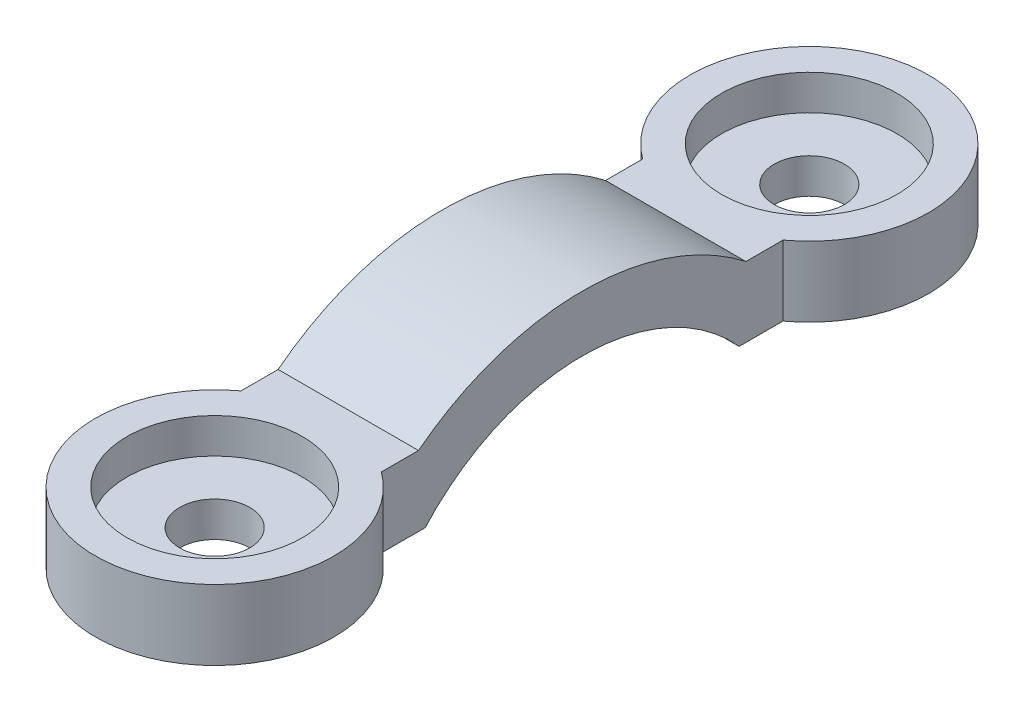
ISO-10303-21;
HEADER;
FILE_DESCRIPTION(('STEP AP214'),'2;1');
FILE_NAME('part.step','',(''),(''),'','','');
FILE_SCHEMA(('AUTOMOTIVE_DESIGN { 1 0 10303 214 1 1 1 1 }'));
ENDSEC;
DATA;
#1=APPLICATION_CONTEXT('core data for automotive mechanical design processes');
#2=APPLICATION_PROTOCOL_DEFINITION('international standard','automotive_design',2000,#1);
#3=PRODUCT_CONTEXT('',#1,'mechanical');
#4=PRODUCT('Part','Part','',(#3));
#5=PRODUCT_RELATED_PRODUCT_CATEGORY('part','',(#4));
#6=PRODUCT_DEFINITION_FORMATION('','',#4);
#7=PRODUCT_DEFINITION_CONTEXT('part definition',#1,'design');
#8=PRODUCT_DEFINITION('design','',#6,#7);
#9=PRODUCT_DEFINITION_SHAPE('','',#8);
#10=(LENGTH_UNIT() NAMED_UNIT(*) SI_UNIT(.MILLI.,.METRE.));
#11=(NAMED_UNIT(*) PLANE_ANGLE_UNIT() SI_UNIT($,.RADIAN.));
#12=(NAMED_UNIT(*) SI_UNIT($,.STERADIAN.) SOLID_ANGLE_UNIT());
#13=UNCERTAINTY_MEASURE_WITH_UNIT(LENGTH_MEASURE(1.E-05),#10,'distance_accuracy_value','');
#14=(GEOMETRIC_REPRESENTATION_CONTEXT(3) GLOBAL_UNCERTAINTY_ASSIGNED_CONTEXT((#13)) GLOBAL_UNIT_ASSIGNED_CONTEXT((#10,
#11,#12)) REPRESENTATION_CONTEXT('',''));
#15=CARTESIAN_POINT('',(0.,0.,0.));
#16=DIRECTION('',(0.,0.,1.));
#17=DIRECTION('',(1.,0.,0.));
#18=AXIS2_PLACEMENT_3D('',#15,#16,#17);
#19=CARTESIAN_POINT('',(5.,19.,21.180339887499));
#20=DIRECTION('',(0.,-1.,0.));
#21=DIRECTION('',(0.,0.,-1.));
#22=AXIS2_PLACEMENT_3D('',#19,#20,#21);
#23=CYLINDRICAL_SURFACE('',#22,2.5);
#24=CARTESIAN_POINT('',(5.,10.,21.180339887499));
#25=DIRECTION('',(0.,-1.,0.));
#26=DIRECTION('',(0.,0.,-1.));
#27=AXIS2_PLACEMENT_3D('',#24,#25,#26);
#28=CIRCLE('',#27,2.5);
#29=CARTESIAN_POINT('',(5.,10.,18.680339887499));
#30=VERTEX_POINT('',#29);
#31=EDGE_CURVE('E169',#30,#30,#28,.T.);
#32=ORIENTED_EDGE('',*,*,#31,.T.);
#33=EDGE_LOOP('',(#32));
#34=FACE_BOUND('',#33,.T.);
#35=CARTESIAN_POINT('',(5.,12.5,21.180339887499));
#36=DIRECTION('',(0.,1.,0.));
#37=DIRECTION('',(0.,0.,1.));
#38=AXIS2_PLACEMENT_3D('',#35,#36,#37);
#39=CIRCLE('',#38,2.5);
#40=CARTESIAN_POINT('',(5.,12.5,23.680339887499));
#41=VERTEX_POINT('',#40);
#42=EDGE_CURVE('E38',#41,#41,#39,.F.);
#43=ORIENTED_EDGE('',*,*,#42,.F.);
#44=EDGE_LOOP('',(#43));
#45=FACE_BOUND('',#44,.T.);
#46=ADVANCED_FACE('F34',(#34,#45),#23,.F.);
#47=CARTESIAN_POINT('',(5.,19.,-21.180339887499));
#48=DIRECTION('',(0.,-1.,0.));
#49=DIRECTION('',(0.,0.,-1.));
#50=AXIS2_PLACEMENT_3D('',#47,#48,#49);
#51=CYLINDRICAL_SURFACE('',#50,2.5);
#52=CARTESIAN_POINT('',(5.,10.,-21.180339887499));
#53=DIRECTION('',(0.,-1.,0.));
#54=DIRECTION('',(0.,0.,1.));
#55=AXIS2_PLACEMENT_3D('',#52,#53,#54);
#56=CIRCLE('',#55,2.5);
#57=CARTESIAN_POINT('',(5.,10.,-18.680339887499));
#58=VERTEX_POINT('',#57);
#59=EDGE_CURVE('E166',#58,#58,#56,.T.);
#60=ORIENTED_EDGE('',*,*,#59,.T.);
#61=EDGE_LOOP('',(#60));
#62=FACE_BOUND('',#61,.T.);
#63=CARTESIAN_POINT('',(5.,12.5,-21.180339887499));
#64=DIRECTION('',(0.,1.,0.));
#65=DIRECTION('',(0.,0.,1.));
#66=AXIS2_PLACEMENT_3D('',#63,#64,#65);
#67=CIRCLE('',#66,2.5);
#68=CARTESIAN_POINT('',(5.,12.5,-18.680339887499));
#69=VERTEX_POINT('',#68);
#70=EDGE_CURVE('E141',#69,#69,#67,.F.);
#71=ORIENTED_EDGE('',*,*,#70,.F.);
#72=EDGE_LOOP('',(#71));
#73=FACE_BOUND('',#72,.T.);
#74=ADVANCED_FACE('F219',(#62,#73),#51,.F.);
#75=CARTESIAN_POINT('',(10.,15.,0.));
#76=DIRECTION('',(0.,-1.,0.));
#77=DIRECTION('',(0.,0.,-1.));
#78=AXIS2_PLACEMENT_3D('',#75,#76,#77);
#79=PLANE('',#78);
#80=CARTESIAN_POINT('',(5.,15.,-21.180339887499));
#81=DIRECTION('',(0.,1.,0.));
#82=DIRECTION('',(0.,0.,1.));
#83=AXIS2_PLACEMENT_3D('',#80,#81,#82);
#84=CIRCLE('',#83,6.25);
#85=CARTESIAN_POINT('',(5.,15.,-14.930339887499));
#86=VERTEX_POINT('',#85);
#87=EDGE_CURVE('E148',#86,#86,#84,.T.);
#88=ORIENTED_EDGE('',*,*,#87,.F.);
#89=EDGE_LOOP('',(#88));
#90=FACE_BOUND('',#89,.T.);
#91=DIRECTION('',(0.,0.,1.));
#92=VECTOR('',#91,1.);
#93=CARTESIAN_POINT('',(10.,15.,0.));
#94=LINE('',#93,#92);
#95=CARTESIAN_POINT('',(10.,15.,-14.3064763450652));
#96=VERTEX_POINT('',#95);
#97=CARTESIAN_POINT('',(10.,15.,-11.6619037896906));
#98=VERTEX_POINT('',#97);
#99=EDGE_CURVE('E122',#96,#98,#94,.T.);
#100=ORIENTED_EDGE('',*,*,#99,.F.);
#101=CARTESIAN_POINT('',(5.,15.,-21.180339887499));
#102=DIRECTION('',(0.,1.,0.));
#103=DIRECTION('',(0.,0.,1.));
#104=AXIS2_PLACEMENT_3D('',#101,#102,#103);
#105=CIRCLE('',#104,8.5);
#106=CARTESIAN_POINT('',(0.,15.,-14.3064763450652));
#107=VERTEX_POINT('',#106);
#108=EDGE_CURVE('E108',#96,#107,#105,.T.);
#109=ORIENTED_EDGE('',*,*,#108,.T.);
#110=DIRECTION('',(0.,0.,1.));
#111=VECTOR('',#110,1.);
#112=CARTESIAN_POINT('',(0.,15.,0.));
#113=LINE('',#112,#111);
#114=CARTESIAN_POINT('',(0.,15.,-11.6619037896906));
#115=VERTEX_POINT('',#114);
#116=EDGE_CURVE('E118',#107,#115,#113,.T.);
#117=ORIENTED_EDGE('',*,*,#116,.T.);
#118=DIRECTION('',(-1.,0.,0.));
#119=VECTOR('',#118,1.);
#120=CARTESIAN_POINT('',(10.,15.,-11.6619037896906));
#121=LINE('',#120,#119);
#122=EDGE_CURVE('E138',#98,#115,#121,.T.);
#123=ORIENTED_EDGE('',*,*,#122,.F.);
#124=EDGE_LOOP('',(#100,#109,#117,#123));
#125=FACE_BOUND('',#124,.T.);
#126=ADVANCED_FACE('F36',(#90,#125),#79,.F.);
#127=CARTESIAN_POINT('',(10.,0.,0.));
#128=DIRECTION('',(-1.,0.,0.));
#129=DIRECTION('',(0.,0.,1.));
#130=AXIS2_PLACEMENT_3D('',#127,#128,#129);
#131=CYLINDRICAL_SURFACE('',#130,19.);
#132=CARTESIAN_POINT('',(0.,0.,0.));
#133=DIRECTION('',(1.,0.,0.));
#134=DIRECTION('',(0.,0.,-1.));
#135=AXIS2_PLACEMENT_3D('',#132,#133,#134);
#136=CIRCLE('',#135,19.);
#137=CARTESIAN_POINT('',(0.,15.,11.6619037896906));
#138=VERTEX_POINT('',#137);
#139=EDGE_CURVE('E181',#115,#138,#136,.T.);
#140=ORIENTED_EDGE('',*,*,#139,.T.);
#141=DIRECTION('',(-1.,0.,0.));
#142=VECTOR('',#141,1.);
#143=CARTESIAN_POINT('',(10.,15.,11.6619037896906));
#144=LINE('',#143,#142);
#145=CARTESIAN_POINT('',(10.,15.,11.6619037896906));
#146=VERTEX_POINT('',#145);
#147=EDGE_CURVE('E135',#146,#138,#144,.T.);
#148=ORIENTED_EDGE('',*,*,#147,.F.);
#149=CARTESIAN_POINT('',(10.,0.,0.));
#150=DIRECTION('',(1.,0.,0.));
#151=DIRECTION('',(0.,0.,-1.));
#152=AXIS2_PLACEMENT_3D('',#149,#150,#151);
#153=CIRCLE('',#152,19.);
#154=EDGE_CURVE('E125',#98,#146,#153,.T.);
#155=ORIENTED_EDGE('',*,*,#154,.F.);
#156=ORIENTED_EDGE('',*,*,#122,.T.);
#157=EDGE_LOOP('',(#140,#148,#155,#156));
#158=FACE_BOUND('',#157,.T.);
#159=ADVANCED_FACE('F204',(#158),#131,.T.);
#160=CARTESIAN_POINT('',(10.,15.,0.));
#161=DIRECTION('',(0.,1.,0.));
#162=DIRECTION('',(0.,0.,1.));
#163=AXIS2_PLACEMENT_3D('',#160,#161,#162);
#164=PLANE('',#163);
#165=CARTESIAN_POINT('',(5.,15.,21.180339887499));
#166=DIRECTION('',(0.,1.,0.));
#167=DIRECTION('',(0.,0.,1.));
#168=AXIS2_PLACEMENT_3D('',#165,#166,#167);
#169=CIRCLE('',#168,6.25);
#170=CARTESIAN_POINT('',(5.,15.,27.430339887499));
#171=VERTEX_POINT('',#170);
#172=EDGE_CURVE('E155',#171,#171,#169,.T.);
#173=ORIENTED_EDGE('',*,*,#172,.F.);
#174=EDGE_LOOP('',(#173));
#175=FACE_BOUND('',#174,.T.);
#176=DIRECTION('',(0.,0.,-1.));
#177=VECTOR('',#176,1.);
#178=CARTESIAN_POINT('',(0.,15.,0.));
#179=LINE('',#178,#177);
#180=CARTESIAN_POINT('',(0.,15.,14.3064763450652));
#181=VERTEX_POINT('',#180);
#182=EDGE_CURVE('E184',#181,#138,#179,.T.);
#183=ORIENTED_EDGE('',*,*,#182,.F.);
#184=CARTESIAN_POINT('',(5.,15.,21.180339887499));
#185=DIRECTION('',(0.,1.,0.));
#186=DIRECTION('',(0.,0.,1.));
#187=AXIS2_PLACEMENT_3D('',#184,#185,#186);
#188=CIRCLE('',#187,8.5);
#189=CARTESIAN_POINT('',(10.,15.,14.3064763450652));
#190=VERTEX_POINT('',#189);
#191=EDGE_CURVE('E159',#181,#190,#188,.T.);
#192=ORIENTED_EDGE('',*,*,#191,.T.);
#193=DIRECTION('',(0.,0.,-1.));
#194=VECTOR('',#193,1.);
#195=CARTESIAN_POINT('',(10.,15.,0.));
#196=LINE('',#195,#194);
#197=EDGE_CURVE('E56',#190,#146,#196,.T.);
#198=ORIENTED_EDGE('',*,*,#197,.T.);
#199=ORIENTED_EDGE('',*,*,#147,.T.);
#200=EDGE_LOOP('',(#183,#192,#198,#199));
#201=FACE_BOUND('',#200,.T.);
#202=ADVANCED_FACE('F207',(#175,#201),#164,.T.);
#203=CARTESIAN_POINT('',(10.,10.,0.));
#204=DIRECTION('',(0.,-1.,0.));
#205=DIRECTION('',(0.,0.,-1.));
#206=AXIS2_PLACEMENT_3D('',#203,#204,#205);
#207=PLANE('',#206);
#208=DIRECTION('',(0.,0.,1.));
#209=VECTOR('',#208,1.);
#210=CARTESIAN_POINT('',(10.,10.,0.));
#211=LINE('',#210,#209);
#212=CARTESIAN_POINT('',(10.,10.,11.1803398874989));
#213=VERTEX_POINT('',#212);
#214=CARTESIAN_POINT('',(10.,10.,14.3064763450652));
#215=VERTEX_POINT('',#214);
#216=EDGE_CURVE('E174',#213,#215,#211,.T.);
#217=ORIENTED_EDGE('',*,*,#216,.T.);
#218=CARTESIAN_POINT('',(5.,10.,21.180339887499));
#219=DIRECTION('',(0.,1.,0.));
#220=DIRECTION('',(0.,0.,1.));
#221=AXIS2_PLACEMENT_3D('',#218,#219,#220);
#222=CIRCLE('',#221,8.5);
#223=CARTESIAN_POINT('',(0.,10.,14.3064763450652));
#224=VERTEX_POINT('',#223);
#225=EDGE_CURVE('E160',#215,#224,#222,.F.);
#226=ORIENTED_EDGE('',*,*,#225,.T.);
#227=DIRECTION('',(0.,0.,1.));
#228=VECTOR('',#227,1.);
#229=CARTESIAN_POINT('',(0.,10.,0.));
#230=LINE('',#229,#228);
#231=CARTESIAN_POINT('',(0.,10.,11.1803398874989));
#232=VERTEX_POINT('',#231);
#233=EDGE_CURVE('E127',#232,#224,#230,.T.);
#234=ORIENTED_EDGE('',*,*,#233,.F.);
#235=DIRECTION('',(-1.,0.,0.));
#236=VECTOR('',#235,1.);
#237=CARTESIAN_POINT('',(10.,10.,11.1803398874989));
#238=LINE('',#237,#236);
#239=EDGE_CURVE('E132',#213,#232,#238,.T.);
#240=ORIENTED_EDGE('',*,*,#239,.F.);
#241=EDGE_LOOP('',(#217,#226,#234,#240));
#242=FACE_BOUND('',#241,.T.);
#243=ORIENTED_EDGE('',*,*,#31,.F.);
#244=EDGE_LOOP('',(#243));
#245=FACE_BOUND('',#244,.T.);
#246=ADVANCED_FACE('F193',(#242,#245),#207,.T.);
#247=CARTESIAN_POINT('',(10.,0.,0.));
#248=DIRECTION('',(-1.,0.,0.));
#249=DIRECTION('',(0.,0.,1.));
#250=AXIS2_PLACEMENT_3D('',#247,#248,#249);
#251=CYLINDRICAL_SURFACE('',#250,15.);
#252=CARTESIAN_POINT('',(0.,0.,0.));
#253=DIRECTION('',(1.,0.,0.));
#254=DIRECTION('',(0.,0.,-1.));
#255=AXIS2_PLACEMENT_3D('',#252,#253,#254);
#256=CIRCLE('',#255,15.);
#257=CARTESIAN_POINT('',(0.,10.,-11.1803398874989));
#258=VERTEX_POINT('',#257);
#259=EDGE_CURVE('E123',#258,#232,#256,.T.);
#260=ORIENTED_EDGE('',*,*,#259,.F.);
#261=DIRECTION('',(-1.,0.,0.));
#262=VECTOR('',#261,1.);
#263=CARTESIAN_POINT('',(10.,10.,-11.1803398874989));
#264=LINE('',#263,#262);
#265=CARTESIAN_POINT('',(10.,10.,-11.1803398874989));
#266=VERTEX_POINT('',#265);
#267=EDGE_CURVE('E121',#266,#258,#264,.T.);
#268=ORIENTED_EDGE('',*,*,#267,.F.);
#269=CARTESIAN_POINT('',(10.,0.,0.));
#270=DIRECTION('',(1.,0.,0.));
#271=DIRECTION('',(0.,0.,-1.));
#272=AXIS2_PLACEMENT_3D('',#269,#270,#271);
#273=CIRCLE('',#272,15.);
#274=EDGE_CURVE('E176',#266,#213,#273,.T.);
#275=ORIENTED_EDGE('',*,*,#274,.T.);
#276=ORIENTED_EDGE('',*,*,#239,.T.);
#277=EDGE_LOOP('',(#260,#268,#275,#276));
#278=FACE_BOUND('',#277,.T.);
#279=ADVANCED_FACE('F198',(#278),#251,.F.);
#280=CARTESIAN_POINT('',(10.,10.,0.));
#281=DIRECTION('',(0.,1.,0.));
#282=DIRECTION('',(0.,0.,1.));
#283=AXIS2_PLACEMENT_3D('',#280,#281,#282);
#284=PLANE('',#283);
#285=DIRECTION('',(0.,0.,-1.));
#286=VECTOR('',#285,1.);
#287=CARTESIAN_POINT('',(0.,10.,0.));
#288=LINE('',#287,#286);
#289=CARTESIAN_POINT('',(0.,10.,-14.3064763450652));
#290=VERTEX_POINT('',#289);
#291=EDGE_CURVE('E115',#258,#290,#288,.T.);
#292=ORIENTED_EDGE('',*,*,#291,.T.);
#293=CARTESIAN_POINT('',(5.,10.,-21.180339887499));
#294=DIRECTION('',(0.,1.,0.));
#295=DIRECTION('',(0.,0.,1.));
#296=AXIS2_PLACEMENT_3D('',#293,#294,#295);
#297=CIRCLE('',#296,8.5);
#298=CARTESIAN_POINT('',(10.,10.,-14.3064763450652));
#299=VERTEX_POINT('',#298);
#300=EDGE_CURVE('E99',#290,#299,#297,.F.);
#301=ORIENTED_EDGE('',*,*,#300,.T.);
#302=DIRECTION('',(0.,0.,-1.));
#303=VECTOR('',#302,1.);
#304=CARTESIAN_POINT('',(10.,10.,0.));
#305=LINE('',#304,#303);
#306=EDGE_CURVE('E133',#266,#299,#305,.T.);
#307=ORIENTED_EDGE('',*,*,#306,.F.);
#308=ORIENTED_EDGE('',*,*,#267,.T.);
#309=EDGE_LOOP('',(#292,#301,#307,#308));
#310=FACE_BOUND('',#309,.T.);
#311=ORIENTED_EDGE('',*,*,#59,.F.);
#312=EDGE_LOOP('',(#311));
#313=FACE_BOUND('',#312,.T.);
#314=ADVANCED_FACE('F119',(#310,#313),#284,.F.);
#315=CARTESIAN_POINT('',(10.,0.,0.));
#316=DIRECTION('',(1.,0.,0.));
#317=DIRECTION('',(0.,0.,-1.));
#318=AXIS2_PLACEMENT_3D('',#315,#316,#317);
#319=PLANE('',#318);
#320=DIRECTION('',(0.,1.,0.));
#321=VECTOR('',#320,1.);
#322=CARTESIAN_POINT('',(10.,-14.0416305603426,-14.3064763450652));
#323=LINE('',#322,#321);
#324=EDGE_CURVE('E103',#96,#299,#323,.F.);
#325=ORIENTED_EDGE('',*,*,#324,.F.);
#326=ORIENTED_EDGE('',*,*,#99,.T.);
#327=ORIENTED_EDGE('',*,*,#154,.T.);
#328=ORIENTED_EDGE('',*,*,#197,.F.);
#329=DIRECTION('',(0.,1.,0.));
#330=VECTOR('',#329,1.);
#331=CARTESIAN_POINT('',(10.,-14.0416305603426,14.3064763450652));
#332=LINE('',#331,#330);
#333=EDGE_CURVE('E51',#215,#190,#332,.T.);
#334=ORIENTED_EDGE('',*,*,#333,.F.);
#335=ORIENTED_EDGE('',*,*,#216,.F.);
#336=ORIENTED_EDGE('',*,*,#274,.F.);
#337=ORIENTED_EDGE('',*,*,#306,.T.);
#338=EDGE_LOOP('',(#325,#326,#327,#328,#334,#335,#336,#337));
#339=FACE_BOUND('',#338,.T.);
#340=ADVANCED_FACE('F196',(#339),#319,.T.);
#341=CARTESIAN_POINT('',(0.,0.,0.));
#342=DIRECTION('',(1.,0.,0.));
#343=DIRECTION('',(0.,0.,-1.));
#344=AXIS2_PLACEMENT_3D('',#341,#342,#343);
#345=PLANE('',#344);
#346=ORIENTED_EDGE('',*,*,#116,.F.);
#347=DIRECTION('',(0.,1.,0.));
#348=VECTOR('',#347,1.);
#349=CARTESIAN_POINT('',(0.,-14.0416305603426,-14.3064763450652));
#350=LINE('',#349,#348);
#351=EDGE_CURVE('E11',#107,#290,#350,.F.);
#352=ORIENTED_EDGE('',*,*,#351,.T.);
#353=ORIENTED_EDGE('',*,*,#291,.F.);
#354=ORIENTED_EDGE('',*,*,#259,.T.);
#355=ORIENTED_EDGE('',*,*,#233,.T.);
#356=DIRECTION('',(0.,1.,0.));
#357=VECTOR('',#356,1.);
#358=CARTESIAN_POINT('',(0.,-14.0416305603426,14.3064763450652));
#359=LINE('',#358,#357);
#360=EDGE_CURVE('E43',#224,#181,#359,.T.);
#361=ORIENTED_EDGE('',*,*,#360,.T.);
#362=ORIENTED_EDGE('',*,*,#182,.T.);
#363=ORIENTED_EDGE('',*,*,#139,.F.);
#364=EDGE_LOOP('',(#346,#352,#353,#354,#355,#361,#362,#363));
#365=FACE_BOUND('',#364,.T.);
#366=ADVANCED_FACE('F113',(#365),#345,.F.);
#367=CARTESIAN_POINT('',(5.,-14.0416305603426,21.1803398874989));
#368=DIRECTION('',(0.,1.,0.));
#369=DIRECTION('',(0.,0.,1.));
#370=AXIS2_PLACEMENT_3D('',#367,#368,#369);
#371=CYLINDRICAL_SURFACE('',#370,8.5);
#372=ORIENTED_EDGE('',*,*,#225,.F.);
#373=ORIENTED_EDGE('',*,*,#333,.T.);
#374=ORIENTED_EDGE('',*,*,#191,.F.);
#375=ORIENTED_EDGE('',*,*,#360,.F.);
#376=EDGE_LOOP('',(#372,#373,#374,#375));
#377=FACE_BOUND('',#376,.T.);
#378=ADVANCED_FACE('F192',(#377),#371,.T.);
#379=CARTESIAN_POINT('',(5.,-14.0416305603426,-21.180339887499));
#380=DIRECTION('',(0.,1.,0.));
#381=DIRECTION('',(0.,0.,1.));
#382=AXIS2_PLACEMENT_3D('',#379,#380,#381);
#383=CYLINDRICAL_SURFACE('',#382,8.5);
#384=ORIENTED_EDGE('',*,*,#108,.F.);
#385=ORIENTED_EDGE('',*,*,#324,.T.);
#386=ORIENTED_EDGE('',*,*,#300,.F.);
#387=ORIENTED_EDGE('',*,*,#351,.F.);
#388=EDGE_LOOP('',(#384,#385,#386,#387));
#389=FACE_BOUND('',#388,.T.);
#390=ADVANCED_FACE('F100',(#389),#383,.T.);
#391=CARTESIAN_POINT('',(5.,12.5,-21.180339887499));
#392=DIRECTION('',(0.,1.,0.));
#393=DIRECTION('',(0.,0.,1.));
#394=AXIS2_PLACEMENT_3D('',#391,#392,#393);
#395=PLANE('',#394);
#396=CARTESIAN_POINT('',(5.,12.5,-21.180339887499));
#397=DIRECTION('',(0.,1.,0.));
#398=DIRECTION('',(0.,0.,1.));
#399=AXIS2_PLACEMENT_3D('',#396,#397,#398);
#400=CIRCLE('',#399,6.25);
#401=CARTESIAN_POINT('',(5.,12.5,-14.930339887499));
#402=VERTEX_POINT('',#401);
#403=EDGE_CURVE('E143',#402,#402,#400,.T.);
#404=ORIENTED_EDGE('',*,*,#403,.T.);
#405=EDGE_LOOP('',(#404));
#406=FACE_BOUND('',#405,.T.);
#407=ORIENTED_EDGE('',*,*,#70,.T.);
#408=EDGE_LOOP('',(#407));
#409=FACE_BOUND('',#408,.T.);
#410=ADVANCED_FACE('F287',(#406,#409),#395,.T.);
#411=CARTESIAN_POINT('',(5.,12.5,-21.180339887499));
#412=DIRECTION('',(0.,1.,0.));
#413=DIRECTION('',(0.,0.,1.));
#414=AXIS2_PLACEMENT_3D('',#411,#412,#413);
#415=CYLINDRICAL_SURFACE('',#414,6.25);
#416=ORIENTED_EDGE('',*,*,#403,.F.);
#417=EDGE_LOOP('',(#416));
#418=FACE_BOUND('',#417,.T.);
#419=ORIENTED_EDGE('',*,*,#87,.T.);
#420=EDGE_LOOP('',(#419));
#421=FACE_BOUND('',#420,.T.);
#422=ADVANCED_FACE('F291',(#418,#421),#415,.F.);
#423=CARTESIAN_POINT('',(5.,12.5,21.180339887499));
#424=DIRECTION('',(0.,1.,0.));
#425=DIRECTION('',(0.,0.,1.));
#426=AXIS2_PLACEMENT_3D('',#423,#424,#425);
#427=PLANE('',#426);
#428=CARTESIAN_POINT('',(5.,12.5,21.180339887499));
#429=DIRECTION('',(0.,1.,0.));
#430=DIRECTION('',(0.,0.,1.));
#431=AXIS2_PLACEMENT_3D('',#428,#429,#430);
#432=CIRCLE('',#431,6.25);
#433=CARTESIAN_POINT('',(5.,12.5,27.430339887499));
#434=VERTEX_POINT('',#433);
#435=EDGE_CURVE('E378',#434,#434,#432,.T.);
#436=ORIENTED_EDGE('',*,*,#435,.T.);
#437=EDGE_LOOP('',(#436));
#438=FACE_BOUND('',#437,.T.);
#439=ORIENTED_EDGE('',*,*,#42,.T.);
#440=EDGE_LOOP('',(#439));
#441=FACE_BOUND('',#440,.T.);
#442=ADVANCED_FACE('F301',(#438,#441),#427,.T.);
#443=CARTESIAN_POINT('',(5.,12.5,21.180339887499));
#444=DIRECTION('',(0.,1.,0.));
#445=DIRECTION('',(0.,0.,1.));
#446=AXIS2_PLACEMENT_3D('',#443,#444,#445);
#447=CYLINDRICAL_SURFACE('',#446,6.25);
#448=ORIENTED_EDGE('',*,*,#435,.F.);
#449=EDGE_LOOP('',(#448));
#450=FACE_BOUND('',#449,.T.);
#451=ORIENTED_EDGE('',*,*,#172,.T.);
#452=EDGE_LOOP('',(#451));
#453=FACE_BOUND('',#452,.T.);
#454=ADVANCED_FACE('F311',(#450,#453),#447,.F.);
#455=CLOSED_SHELL('',(#46,#74,#126,#159,#202,#246,#279,#314,#340,#366,#378,#390,#410,#422,#442,#454));
#456=MANIFOLD_SOLID_BREP('B2',#455);
#457=ADVANCED_BREP_SHAPE_REPRESENTATION('',(#18,#456),#14);
#458=SHAPE_DEFINITION_REPRESENTATION(#9,#457);
ENDSEC;
END-ISO-10303-21;
